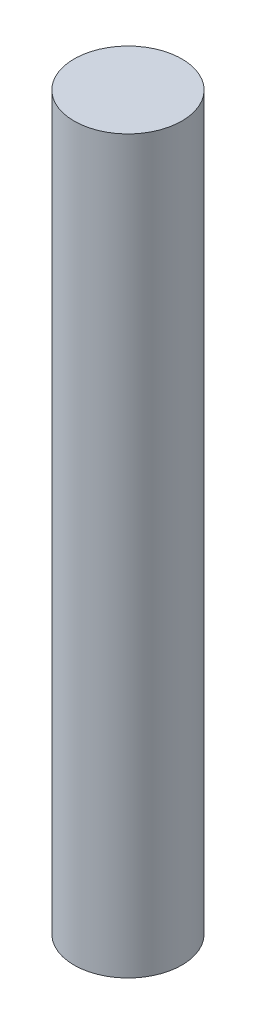
ISO-10303-21;
HEADER;
FILE_DESCRIPTION(('STEP AP214'),'2;1');
FILE_NAME('part.step','',(''),(''),'','','');
FILE_SCHEMA(('AUTOMOTIVE_DESIGN { 1 0 10303 214 1 1 1 1 }'));
ENDSEC;
DATA;
#1=APPLICATION_CONTEXT('core data for automotive mechanical design processes');
#2=APPLICATION_PROTOCOL_DEFINITION('international standard','automotive_design',2000,#1);
#3=PRODUCT_CONTEXT('',#1,'mechanical');
#4=PRODUCT('Part','Part','',(#3));
#5=PRODUCT_RELATED_PRODUCT_CATEGORY('part','',(#4));
#6=PRODUCT_DEFINITION_FORMATION('','',#4);
#7=PRODUCT_DEFINITION_CONTEXT('part definition',#1,'design');
#8=PRODUCT_DEFINITION('design','',#6,#7);
#9=PRODUCT_DEFINITION_SHAPE('','',#8);
#10=(LENGTH_UNIT() NAMED_UNIT(*) SI_UNIT(.MILLI.,.METRE.));
#11=(NAMED_UNIT(*) PLANE_ANGLE_UNIT() SI_UNIT($,.RADIAN.));
#12=(NAMED_UNIT(*) SI_UNIT($,.STERADIAN.) SOLID_ANGLE_UNIT());
#13=UNCERTAINTY_MEASURE_WITH_UNIT(LENGTH_MEASURE(1.E-05),#10,'distance_accuracy_value','');
#14=(GEOMETRIC_REPRESENTATION_CONTEXT(3) GLOBAL_UNCERTAINTY_ASSIGNED_CONTEXT((#13)) GLOBAL_UNIT_ASSIGNED_CONTEXT((#10,
#11,#12)) REPRESENTATION_CONTEXT('',''));
#15=CARTESIAN_POINT('',(0.,0.,0.));
#16=DIRECTION('',(0.,0.,1.));
#17=DIRECTION('',(1.,0.,0.));
#18=AXIS2_PLACEMENT_3D('',#15,#16,#17);
#19=CARTESIAN_POINT('',(0.,19.,0.));
#20=DIRECTION('',(0.,-1.,0.));
#21=DIRECTION('',(0.,0.,-1.));
#22=AXIS2_PLACEMENT_3D('',#19,#20,#21);
#23=CYLINDRICAL_SURFACE('',#22,1.4);
#24=CARTESIAN_POINT('',(0.,19.,0.));
#25=DIRECTION('',(0.,1.,0.));
#26=DIRECTION('',(0.,0.,1.));
#27=AXIS2_PLACEMENT_3D('',#24,#25,#26);
#28=CIRCLE('',#27,1.4);
#29=CARTESIAN_POINT('',(0.,19.,1.4));
#30=VERTEX_POINT('',#29);
#31=EDGE_CURVE('E10',#30,#30,#28,.T.);
#32=ORIENTED_EDGE('',*,*,#31,.F.);
#33=EDGE_LOOP('',(#32));
#34=FACE_BOUND('',#33,.T.);
#35=CARTESIAN_POINT('',(0.,0.,0.));
#36=DIRECTION('',(0.,1.,0.));
#37=DIRECTION('',(0.,0.,1.));
#38=AXIS2_PLACEMENT_3D('',#35,#36,#37);
#39=CIRCLE('',#38,1.4);
#40=CARTESIAN_POINT('',(0.,0.,1.4));
#41=VERTEX_POINT('',#40);
#42=EDGE_CURVE('E36',#41,#41,#39,.T.);
#43=ORIENTED_EDGE('',*,*,#42,.T.);
#44=EDGE_LOOP('',(#43));
#45=FACE_BOUND('',#44,.T.);
#46=ADVANCED_FACE('F33',(#34,#45),#23,.T.);
#47=CARTESIAN_POINT('',(0.,19.,0.));
#48=DIRECTION('',(0.,1.,0.));
#49=DIRECTION('',(0.,0.,1.));
#50=AXIS2_PLACEMENT_3D('',#47,#48,#49);
#51=PLANE('',#50);
#52=ORIENTED_EDGE('',*,*,#31,.T.);
#53=EDGE_LOOP('',(#52));
#54=FACE_BOUND('',#53,.T.);
#55=ADVANCED_FACE('F48',(#54),#51,.T.);
#56=CARTESIAN_POINT('',(0.,0.,0.));
#57=DIRECTION('',(0.,1.,0.));
#58=DIRECTION('',(0.,0.,1.));
#59=AXIS2_PLACEMENT_3D('',#56,#57,#58);
#60=PLANE('',#59);
#61=ORIENTED_EDGE('',*,*,#42,.F.);
#62=EDGE_LOOP('',(#61));
#63=FACE_BOUND('',#62,.T.);
#64=ADVANCED_FACE('F46',(#63),#60,.F.);
#65=CLOSED_SHELL('',(#46,#55,#64));
#66=MANIFOLD_SOLID_BREP('B2',#65);
#67=ADVANCED_BREP_SHAPE_REPRESENTATION('',(#18,#66),#14);
#68=SHAPE_DEFINITION_REPRESENTATION(#9,#67);
ENDSEC;
END-ISO-10303-21;
